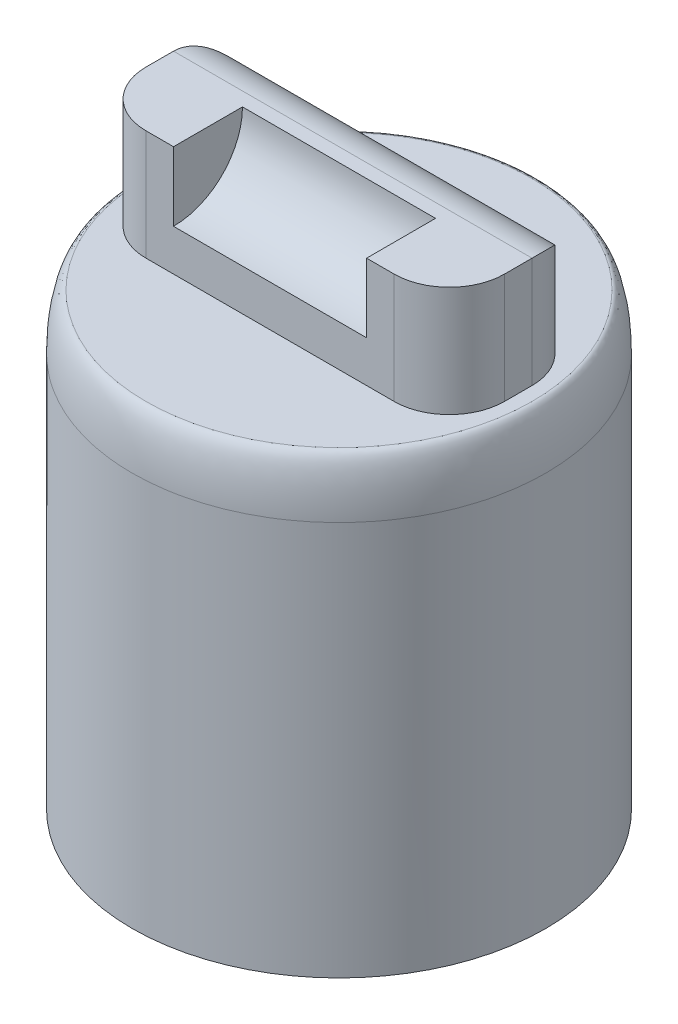
ISO-10303-21;
HEADER;
FILE_DESCRIPTION(('STEP AP214'),'2;1');
FILE_NAME('part.step','',(''),(''),'','','');
FILE_SCHEMA(('AUTOMOTIVE_DESIGN { 1 0 10303 214 1 1 1 1 }'));
ENDSEC;
DATA;
#1=APPLICATION_CONTEXT('core data for automotive mechanical design processes');
#2=APPLICATION_PROTOCOL_DEFINITION('international standard','automotive_design',2000,#1);
#3=PRODUCT_CONTEXT('',#1,'mechanical');
#4=PRODUCT('Part','Part','',(#3));
#5=PRODUCT_RELATED_PRODUCT_CATEGORY('part','',(#4));
#6=PRODUCT_DEFINITION_FORMATION('','',#4);
#7=PRODUCT_DEFINITION_CONTEXT('part definition',#1,'design');
#8=PRODUCT_DEFINITION('design','',#6,#7);
#9=PRODUCT_DEFINITION_SHAPE('','',#8);
#10=(LENGTH_UNIT() NAMED_UNIT(*) SI_UNIT(.MILLI.,.METRE.));
#11=(NAMED_UNIT(*) PLANE_ANGLE_UNIT() SI_UNIT($,.RADIAN.));
#12=(NAMED_UNIT(*) SI_UNIT($,.STERADIAN.) SOLID_ANGLE_UNIT());
#13=UNCERTAINTY_MEASURE_WITH_UNIT(LENGTH_MEASURE(1.E-05),#10,'distance_accuracy_value','');
#14=(GEOMETRIC_REPRESENTATION_CONTEXT(3) GLOBAL_UNCERTAINTY_ASSIGNED_CONTEXT((#13)) GLOBAL_UNIT_ASSIGNED_CONTEXT((#10,
#11,#12)) REPRESENTATION_CONTEXT('',''));
#15=CARTESIAN_POINT('',(0.,0.,0.));
#16=DIRECTION('',(0.,0.,1.));
#17=DIRECTION('',(1.,0.,0.));
#18=AXIS2_PLACEMENT_3D('',#15,#16,#17);
#19=CARTESIAN_POINT('',(0.,163.,0.));
#20=DIRECTION('',(0.,-1.,0.));
#21=DIRECTION('',(0.,0.,-1.));
#22=AXIS2_PLACEMENT_3D('',#19,#20,#21);
#23=CYLINDRICAL_SURFACE('',#22,75.);
#24=CARTESIAN_POINT('',(0.,143.,75.));
#25=CARTESIAN_POINT('',(9.8174770420761,143.,75.));
#26=CARTESIAN_POINT('',(19.6310913272354,143.,73.0479507500038));
#27=CARTESIAN_POINT('',(37.771423527528,143.,65.5339791266892));
#28=CARTESIAN_POINT('',(46.0910039983612,143.,59.9750131796209));
#29=CARTESIAN_POINT('',(59.9750131796209,143.,46.0910039983612));
#30=CARTESIAN_POINT('',(65.5339791267019,143.,37.7714235274974));
#31=CARTESIAN_POINT('',(73.0479507499911,143.,19.631091327266));
#32=CARTESIAN_POINT('',(75.,143.,9.81747704213418));
#33=CARTESIAN_POINT('',(75.,143.,-9.81747704213417));
#34=CARTESIAN_POINT('',(73.0479507500004,143.,-19.6310913272436));
#35=CARTESIAN_POINT('',(65.5339791266926,143.,-37.7714235275199));
#36=CARTESIAN_POINT('',(59.9750131796209,143.,-46.0910039983612));
#37=CARTESIAN_POINT('',(46.0910039983611,143.,-59.975013179621));
#38=CARTESIAN_POINT('',(37.7714235274975,143.,-65.5339791267018));
#39=CARTESIAN_POINT('',(19.6310913272661,143.,-73.0479507499911));
#40=CARTESIAN_POINT('',(9.81747704213418,143.,-75.));
#41=CARTESIAN_POINT('',(-9.81747704213417,143.,-75.));
#42=CARTESIAN_POINT('',(-19.6310913272388,143.,-73.0479507500024));
#43=CARTESIAN_POINT('',(-37.7714235275244,143.,-65.5339791266907));
#44=CARTESIAN_POINT('',(-46.0910039983453,143.,-59.9750131796368));
#45=CARTESIAN_POINT('',(-59.9750131796368,143.,-46.0910039983452));
#46=CARTESIAN_POINT('',(-65.5339791266992,143.,-37.7714235275038));
#47=CARTESIAN_POINT('',(-73.0479507499937,143.,-19.6310913272598));
#48=CARTESIAN_POINT('',(-75.,143.,-9.81747704213407));
#49=CARTESIAN_POINT('',(-75.,143.,9.81747704213431));
#50=CARTESIAN_POINT('',(-73.0479507499937,143.,19.6310913272596));
#51=CARTESIAN_POINT('',(-65.5339791266993,143.,37.7714235275037));
#52=CARTESIAN_POINT('',(-59.9750131796461,143.,46.0910039983359));
#53=CARTESIAN_POINT('',(-46.0910039983363,143.,59.9750131796458));
#54=CARTESIAN_POINT('',(-37.7714235275039,143.,65.5339791266992));
#55=CARTESIAN_POINT('',(-19.6310913272598,143.,73.0479507499937));
#56=CARTESIAN_POINT('',(-9.81747704207611,143.,75.));
#57=CARTESIAN_POINT('',(0.,143.,75.));
#58=(BOUNDED_CURVE() B_SPLINE_CURVE(3,(#24,#25,#26,#27,#28,#29,#30,#31,#32,#33,#34,#35,#36,#37,
#38,#39,#40,#41,#42,#43,#44,#45,#46,#47,#48,#49,#50,#51,#52,#53,#54,#55,#56,#57),.UNSPECIFIED.,
.T.,.F.) B_SPLINE_CURVE_WITH_KNOTS((4,2,2,2,2,2,2,2,2,2,2,2,2,2,2,2,4),(0.,0.392699081698724,
0.785398163397448,1.17809724509617,1.5707963267949,1.96349540849362,2.35619449019234,
2.74889357189107,3.14159265358979,3.53429173528852,3.92699081698724,4.31968989868597,
4.71238898038469,5.10508806208341,5.49778714378214,5.89048622548086,6.28318530717959),
.UNSPECIFIED.) CURVE() GEOMETRIC_REPRESENTATION_ITEM() RATIONAL_B_SPLINE_CURVE((1.,1.,1.,1.,1.,
1.,1.,1.,1.,1.,1.,1.,1.,1.,1.,1.,1.,1.,1.,1.,1.,1.,1.,1.,1.,1.,1.,1.,1.,1.,1.,1.,1.,1.)) REPRESENTATION_ITEM(''));
#59=CARTESIAN_POINT('',(0.,143.,75.));
#60=VERTEX_POINT('',#59);
#61=EDGE_CURVE('E234',#60,#60,#58,.F.);
#62=ORIENTED_EDGE('',*,*,#61,.T.);
#63=EDGE_LOOP('',(#62));
#64=FACE_BOUND('',#63,.T.);
#65=CARTESIAN_POINT('',(0.,0.,0.));
#66=DIRECTION('',(0.,1.,0.));
#67=DIRECTION('',(0.,0.,1.));
#68=AXIS2_PLACEMENT_3D('',#65,#66,#67);
#69=CIRCLE('',#68,75.);
#70=CARTESIAN_POINT('',(0.,0.,75.));
#71=VERTEX_POINT('',#70);
#72=EDGE_CURVE('E164',#71,#71,#69,.T.);
#73=ORIENTED_EDGE('',*,*,#72,.T.);
#74=EDGE_LOOP('',(#73));
#75=FACE_BOUND('',#74,.T.);
#76=ADVANCED_FACE('F39',(#64,#75),#23,.T.);
#77=CARTESIAN_POINT('',(0.,163.,0.));
#78=DIRECTION('',(0.,1.,0.));
#79=DIRECTION('',(0.,0.,1.));
#80=AXIS2_PLACEMENT_3D('',#77,#78,#79);
#81=PLANE('',#80);
#82=CARTESIAN_POINT('',(0.,163.,70.));
#83=CARTESIAN_POINT('',(-9.16297857260437,163.,70.));
#84=CARTESIAN_POINT('',(-18.322351905432,163.,68.1780873666415));
#85=CARTESIAN_POINT('',(-35.2533286256808,163.,61.1650471849386));
#86=CARTESIAN_POINT('',(-43.0182703984641,163.,55.9766789676525));
#87=CARTESIAN_POINT('',(-55.9766789676528,163.,43.0182703984638));
#88=CARTESIAN_POINT('',(-61.1650471849386,163.,35.2533286256806));
#89=CARTESIAN_POINT('',(-68.1780873666415,163.,18.3223519054318));
#90=CARTESIAN_POINT('',(-70.,163.,9.16297857265868));
#91=CARTESIAN_POINT('',(-70.,163.,-9.16297857265846));
#92=CARTESIAN_POINT('',(-68.1780873666415,163.,-18.322351905432));
#93=CARTESIAN_POINT('',(-61.1650471849386,163.,-35.2533286256807));
#94=CARTESIAN_POINT('',(-55.9766789676738,163.,-43.0182703984746));
#95=CARTESIAN_POINT('',(-43.0182703984429,163.,-55.9766789676419));
#96=CARTESIAN_POINT('',(-35.2533286256876,163.,-61.1650471849205));
#97=CARTESIAN_POINT('',(-18.3223519054247,163.,-68.1780873666597));
#98=CARTESIAN_POINT('',(-9.16297857265855,163.,-70.));
#99=CARTESIAN_POINT('',(9.16297857265857,163.,-70.));
#100=CARTESIAN_POINT('',(18.3223519054408,163.,-68.1780873666596));
#101=CARTESIAN_POINT('',(35.2533286256719,163.,-61.1650471849204));
#102=CARTESIAN_POINT('',(43.0182703984746,163.,-55.976678967642));
#103=CARTESIAN_POINT('',(55.9766789676419,163.,-43.0182703984747));
#104=CARTESIAN_POINT('',(61.1650471848569,163.,-35.2533286256718));
#105=CARTESIAN_POINT('',(68.1780873667232,163.,-18.3223519054408));
#106=CARTESIAN_POINT('',(70.,163.,-9.16297857265856));
#107=CARTESIAN_POINT('',(70.,163.,9.16297857265856));
#108=CARTESIAN_POINT('',(68.1780873666597,163.,18.3223519054407));
#109=CARTESIAN_POINT('',(61.1650471849205,163.,35.2533286256718));
#110=CARTESIAN_POINT('',(55.9766789676738,163.,43.0182703984747));
#111=CARTESIAN_POINT('',(43.0182703984429,163.,55.976678967642));
#112=CARTESIAN_POINT('',(35.2533286256729,163.,61.1650471849068));
#113=CARTESIAN_POINT('',(18.3223519054396,163.,68.1780873666733));
#114=CARTESIAN_POINT('',(9.16297857260436,163.,70.));
#115=CARTESIAN_POINT('',(0.,163.,70.));
#116=(BOUNDED_CURVE() B_SPLINE_CURVE(3,(#82,#83,#84,#85,#86,#87,#88,#89,#90,#91,#92,#93,#94,#95,
#96,#97,#98,#99,#100,#101,#102,#103,#104,#105,#106,#107,#108,#109,#110,#111,#112,#113,#114,
#115),.UNSPECIFIED.,.T.,.F.) B_SPLINE_CURVE_WITH_KNOTS((4,2,2,2,2,2,2,2,2,2,2,2,2,2,2,2,4),(0.,
0.392699081698725,0.785398163397448,1.17809724509617,1.5707963267949,1.96349540849362,
2.35619449019234,2.74889357189107,3.14159265358979,3.53429173528852,3.92699081698724,
4.31968989868597,4.71238898038469,5.10508806208341,5.49778714378214,5.89048622548086,
6.28318530717959),
.UNSPECIFIED.) CURVE() GEOMETRIC_REPRESENTATION_ITEM() RATIONAL_B_SPLINE_CURVE((1.,1.,1.,1.,1.,
1.,1.,1.,1.,1.,1.,1.,1.,1.,1.,1.,1.,1.,1.,1.,1.,1.,1.,1.,1.,1.,1.,1.,1.,1.,1.,1.,1.,1.)) REPRESENTATION_ITEM(''));
#117=CARTESIAN_POINT('',(0.,163.,70.));
#118=VERTEX_POINT('',#117);
#119=EDGE_CURVE('E177',#118,#118,#116,.F.);
#120=ORIENTED_EDGE('',*,*,#119,.T.);
#121=EDGE_LOOP('',(#120));
#122=FACE_BOUND('',#121,.T.);
#123=DIRECTION('',(0.,0.,-1.));
#124=VECTOR('',#123,1.);
#125=CARTESIAN_POINT('',(65.,163.,-25.));
#126=LINE('',#125,#124);
#127=CARTESIAN_POINT('',(65.,163.,5.00000000000001));
#128=VERTEX_POINT('',#127);
#129=CARTESIAN_POINT('',(65.,163.,-5.));
#130=VERTEX_POINT('',#129);
#131=EDGE_CURVE('E148',#128,#130,#126,.T.);
#132=ORIENTED_EDGE('',*,*,#131,.F.);
#133=CARTESIAN_POINT('',(45.,163.,5.00000000000001));
#134=DIRECTION('',(0.,1.,0.));
#135=DIRECTION('',(0.,0.,1.));
#136=AXIS2_PLACEMENT_3D('',#133,#134,#135);
#137=CIRCLE('',#136,20.);
#138=CARTESIAN_POINT('',(45.,163.,25.));
#139=VERTEX_POINT('',#138);
#140=EDGE_CURVE('E269',#128,#139,#137,.F.);
#141=ORIENTED_EDGE('',*,*,#140,.T.);
#142=DIRECTION('',(1.,0.,0.));
#143=VECTOR('',#142,1.);
#144=CARTESIAN_POINT('',(-65.,163.,25.));
#145=LINE('',#144,#143);
#146=CARTESIAN_POINT('',(-45.,163.,25.));
#147=VERTEX_POINT('',#146);
#148=EDGE_CURVE('E159',#147,#139,#145,.T.);
#149=ORIENTED_EDGE('',*,*,#148,.F.);
#150=CARTESIAN_POINT('',(-45.,163.,5.00000000000001));
#151=DIRECTION('',(0.,1.,0.));
#152=DIRECTION('',(0.,0.,1.));
#153=AXIS2_PLACEMENT_3D('',#150,#151,#152);
#154=CIRCLE('',#153,20.);
#155=CARTESIAN_POINT('',(-65.,163.,5.00000000000001));
#156=VERTEX_POINT('',#155);
#157=EDGE_CURVE('E48',#147,#156,#154,.F.);
#158=ORIENTED_EDGE('',*,*,#157,.T.);
#159=DIRECTION('',(0.,0.,1.));
#160=VECTOR('',#159,1.);
#161=CARTESIAN_POINT('',(-65.,163.,-25.));
#162=LINE('',#161,#160);
#163=CARTESIAN_POINT('',(-65.,163.,-5.));
#164=VERTEX_POINT('',#163);
#165=EDGE_CURVE('E168',#164,#156,#162,.T.);
#166=ORIENTED_EDGE('',*,*,#165,.F.);
#167=CARTESIAN_POINT('',(-45.,163.,-5.));
#168=DIRECTION('',(0.,1.,0.));
#169=DIRECTION('',(0.,0.,1.));
#170=AXIS2_PLACEMENT_3D('',#167,#168,#169);
#171=CIRCLE('',#170,20.);
#172=CARTESIAN_POINT('',(-45.,163.,-25.));
#173=VERTEX_POINT('',#172);
#174=EDGE_CURVE('E12',#164,#173,#171,.F.);
#175=ORIENTED_EDGE('',*,*,#174,.T.);
#176=DIRECTION('',(-1.,0.,0.));
#177=VECTOR('',#176,1.);
#178=CARTESIAN_POINT('',(-65.,163.,-25.));
#179=LINE('',#178,#177);
#180=CARTESIAN_POINT('',(45.,163.,-25.));
#181=VERTEX_POINT('',#180);
#182=EDGE_CURVE('E151',#181,#173,#179,.T.);
#183=ORIENTED_EDGE('',*,*,#182,.F.);
#184=CARTESIAN_POINT('',(45.,163.,-5.));
#185=DIRECTION('',(0.,1.,0.));
#186=DIRECTION('',(0.,0.,1.));
#187=AXIS2_PLACEMENT_3D('',#184,#185,#186);
#188=CIRCLE('',#187,20.);
#189=EDGE_CURVE('E271',#181,#130,#188,.F.);
#190=ORIENTED_EDGE('',*,*,#189,.T.);
#191=EDGE_LOOP('',(#132,#141,#149,#158,#166,#175,#183,#190));
#192=FACE_BOUND('',#191,.T.);
#193=ADVANCED_FACE('F188',(#122,#192),#81,.T.);
#194=CARTESIAN_POINT('',(0.,0.,0.));
#195=DIRECTION('',(0.,1.,0.));
#196=DIRECTION('',(0.,0.,1.));
#197=AXIS2_PLACEMENT_3D('',#194,#195,#196);
#198=PLANE('',#197);
#199=ORIENTED_EDGE('',*,*,#72,.F.);
#200=EDGE_LOOP('',(#199));
#201=FACE_BOUND('',#200,.T.);
#202=ADVANCED_FACE('F198',(#201),#198,.F.);
#203=CARTESIAN_POINT('',(65.,203.,-25.));
#204=DIRECTION('',(-1.,0.,0.));
#205=DIRECTION('',(0.,0.,1.));
#206=AXIS2_PLACEMENT_3D('',#203,#204,#205);
#207=PLANE('',#206);
#208=DIRECTION('',(0.,0.,-1.));
#209=VECTOR('',#208,1.);
#210=CARTESIAN_POINT('',(65.,203.,-25.));
#211=LINE('',#210,#209);
#212=CARTESIAN_POINT('',(65.,203.,5.00000000000001));
#213=VERTEX_POINT('',#212);
#214=CARTESIAN_POINT('',(65.,203.,-5.));
#215=VERTEX_POINT('',#214);
#216=EDGE_CURVE('E155',#213,#215,#211,.T.);
#217=ORIENTED_EDGE('',*,*,#216,.F.);
#218=DIRECTION('',(0.,-1.,0.));
#219=VECTOR('',#218,1.);
#220=CARTESIAN_POINT('',(65.,203.,5.00000000000001));
#221=LINE('',#220,#219);
#222=EDGE_CURVE('E258',#213,#128,#221,.T.);
#223=ORIENTED_EDGE('',*,*,#222,.T.);
#224=ORIENTED_EDGE('',*,*,#131,.T.);
#225=DIRECTION('',(0.,-1.,0.));
#226=VECTOR('',#225,1.);
#227=CARTESIAN_POINT('',(65.,203.,-5.));
#228=LINE('',#227,#226);
#229=EDGE_CURVE('E256',#130,#215,#228,.F.);
#230=ORIENTED_EDGE('',*,*,#229,.T.);
#231=EDGE_LOOP('',(#217,#223,#224,#230));
#232=FACE_BOUND('',#231,.T.);
#233=ADVANCED_FACE('F199',(#232),#207,.F.);
#234=CARTESIAN_POINT('',(-65.,203.,-25.));
#235=DIRECTION('',(0.,0.,1.));
#236=DIRECTION('',(1.,0.,0.));
#237=AXIS2_PLACEMENT_3D('',#234,#235,#236);
#238=PLANE('',#237);
#239=DIRECTION('',(-1.,0.,0.));
#240=VECTOR('',#239,1.);
#241=CARTESIAN_POINT('',(65.,183.,-25.));
#242=LINE('',#241,#240);
#243=CARTESIAN_POINT('',(-45.,183.,-25.));
#244=VERTEX_POINT('',#243);
#245=CARTESIAN_POINT('',(45.,183.,-25.));
#246=VERTEX_POINT('',#245);
#247=EDGE_CURVE('E252',#244,#246,#242,.F.);
#248=ORIENTED_EDGE('',*,*,#247,.T.);
#249=DIRECTION('',(0.,-1.,0.));
#250=VECTOR('',#249,1.);
#251=CARTESIAN_POINT('',(45.,203.,-25.));
#252=LINE('',#251,#250);
#253=EDGE_CURVE('E254',#246,#181,#252,.T.);
#254=ORIENTED_EDGE('',*,*,#253,.T.);
#255=ORIENTED_EDGE('',*,*,#182,.T.);
#256=DIRECTION('',(0.,-1.,0.));
#257=VECTOR('',#256,1.);
#258=CARTESIAN_POINT('',(-45.,203.,-25.));
#259=LINE('',#258,#257);
#260=EDGE_CURVE('E250',#173,#244,#259,.F.);
#261=ORIENTED_EDGE('',*,*,#260,.T.);
#262=EDGE_LOOP('',(#248,#254,#255,#261));
#263=FACE_BOUND('',#262,.T.);
#264=ADVANCED_FACE('F288',(#263),#238,.F.);
#265=CARTESIAN_POINT('',(-65.,203.,-25.));
#266=DIRECTION('',(1.,0.,0.));
#267=DIRECTION('',(0.,0.,-1.));
#268=AXIS2_PLACEMENT_3D('',#265,#266,#267);
#269=PLANE('',#268);
#270=ORIENTED_EDGE('',*,*,#165,.T.);
#271=DIRECTION('',(0.,-1.,0.));
#272=VECTOR('',#271,1.);
#273=CARTESIAN_POINT('',(-65.,203.,5.00000000000001));
#274=LINE('',#273,#272);
#275=CARTESIAN_POINT('',(-65.,203.,5.00000000000001));
#276=VERTEX_POINT('',#275);
#277=EDGE_CURVE('E267',#156,#276,#274,.F.);
#278=ORIENTED_EDGE('',*,*,#277,.T.);
#279=DIRECTION('',(0.,0.,1.));
#280=VECTOR('',#279,1.);
#281=CARTESIAN_POINT('',(-65.,203.,-25.));
#282=LINE('',#281,#280);
#283=CARTESIAN_POINT('',(-65.,203.,-5.));
#284=VERTEX_POINT('',#283);
#285=EDGE_CURVE('E158',#284,#276,#282,.T.);
#286=ORIENTED_EDGE('',*,*,#285,.F.);
#287=DIRECTION('',(0.,-1.,0.));
#288=VECTOR('',#287,1.);
#289=CARTESIAN_POINT('',(-65.,203.,-5.));
#290=LINE('',#289,#288);
#291=EDGE_CURVE('E62',#284,#164,#290,.T.);
#292=ORIENTED_EDGE('',*,*,#291,.T.);
#293=EDGE_LOOP('',(#270,#278,#286,#292));
#294=FACE_BOUND('',#293,.T.);
#295=ADVANCED_FACE('F298',(#294),#269,.F.);
#296=CARTESIAN_POINT('',(-65.,203.,25.));
#297=DIRECTION('',(0.,0.,-1.));
#298=DIRECTION('',(-1.,0.,0.));
#299=AXIS2_PLACEMENT_3D('',#296,#297,#298);
#300=PLANE('',#299);
#301=ORIENTED_EDGE('',*,*,#148,.T.);
#302=DIRECTION('',(0.,-1.,0.));
#303=VECTOR('',#302,1.);
#304=CARTESIAN_POINT('',(45.,203.,25.));
#305=LINE('',#304,#303);
#306=CARTESIAN_POINT('',(45.,203.,25.));
#307=VERTEX_POINT('',#306);
#308=EDGE_CURVE('E264',#139,#307,#305,.F.);
#309=ORIENTED_EDGE('',*,*,#308,.T.);
#310=DIRECTION('',(1.,0.,0.));
#311=VECTOR('',#310,1.);
#312=CARTESIAN_POINT('',(-65.,203.,25.));
#313=LINE('',#312,#311);
#314=CARTESIAN_POINT('',(35.,203.,25.));
#315=VERTEX_POINT('',#314);
#316=EDGE_CURVE('E162',#315,#307,#313,.T.);
#317=ORIENTED_EDGE('',*,*,#316,.F.);
#318=DIRECTION('',(0.,-1.,0.));
#319=VECTOR('',#318,1.);
#320=CARTESIAN_POINT('',(35.,203.,25.));
#321=LINE('',#320,#319);
#322=CARTESIAN_POINT('',(35.,178.,25.));
#323=VERTEX_POINT('',#322);
#324=EDGE_CURVE('E133',#315,#323,#321,.T.);
#325=ORIENTED_EDGE('',*,*,#324,.T.);
#326=DIRECTION('',(-1.,0.,0.));
#327=VECTOR('',#326,1.);
#328=CARTESIAN_POINT('',(35.,178.,25.));
#329=LINE('',#328,#327);
#330=CARTESIAN_POINT('',(-35.,178.,25.));
#331=VERTEX_POINT('',#330);
#332=EDGE_CURVE('E139',#331,#323,#329,.F.);
#333=ORIENTED_EDGE('',*,*,#332,.F.);
#334=DIRECTION('',(0.,-1.,0.));
#335=VECTOR('',#334,1.);
#336=CARTESIAN_POINT('',(-35.,203.,25.));
#337=LINE('',#336,#335);
#338=CARTESIAN_POINT('',(-35.,203.,25.));
#339=VERTEX_POINT('',#338);
#340=EDGE_CURVE('E123',#339,#331,#337,.T.);
#341=ORIENTED_EDGE('',*,*,#340,.F.);
#342=CARTESIAN_POINT('',(-45.,203.,25.));
#343=VERTEX_POINT('',#342);
#344=EDGE_CURVE('E163',#343,#339,#313,.T.);
#345=ORIENTED_EDGE('',*,*,#344,.F.);
#346=DIRECTION('',(0.,-1.,0.));
#347=VECTOR('',#346,1.);
#348=CARTESIAN_POINT('',(-45.,203.,25.));
#349=LINE('',#348,#347);
#350=EDGE_CURVE('E261',#343,#147,#349,.T.);
#351=ORIENTED_EDGE('',*,*,#350,.T.);
#352=EDGE_LOOP('',(#301,#309,#317,#325,#333,#341,#345,#351));
#353=FACE_BOUND('',#352,.T.);
#354=ADVANCED_FACE('F146',(#353),#300,.F.);
#355=CARTESIAN_POINT('',(0.,203.,0.));
#356=DIRECTION('',(0.,1.,0.));
#357=DIRECTION('',(0.,0.,1.));
#358=AXIS2_PLACEMENT_3D('',#355,#356,#357);
#359=PLANE('',#358);
#360=ORIENTED_EDGE('',*,*,#216,.T.);
#361=DIRECTION('',(-1.,0.,0.));
#362=VECTOR('',#361,1.);
#363=CARTESIAN_POINT('',(-65.,203.,-5.));
#364=LINE('',#363,#362);
#365=EDGE_CURVE('E247',#215,#284,#364,.T.);
#366=ORIENTED_EDGE('',*,*,#365,.T.);
#367=ORIENTED_EDGE('',*,*,#285,.T.);
#368=CARTESIAN_POINT('',(-45.,203.,5.00000000000001));
#369=DIRECTION('',(0.,1.,0.));
#370=DIRECTION('',(0.,0.,1.));
#371=AXIS2_PLACEMENT_3D('',#368,#369,#370);
#372=CIRCLE('',#371,20.);
#373=EDGE_CURVE('E238',#276,#343,#372,.T.);
#374=ORIENTED_EDGE('',*,*,#373,.T.);
#375=ORIENTED_EDGE('',*,*,#344,.T.);
#376=DIRECTION('',(0.,0.,-1.));
#377=VECTOR('',#376,1.);
#378=CARTESIAN_POINT('',(-35.,203.,0.));
#379=LINE('',#378,#377);
#380=CARTESIAN_POINT('',(-35.,203.,0.));
#381=VERTEX_POINT('',#380);
#382=EDGE_CURVE('E129',#339,#381,#379,.T.);
#383=ORIENTED_EDGE('',*,*,#382,.T.);
#384=DIRECTION('',(-1.,0.,0.));
#385=VECTOR('',#384,1.);
#386=CARTESIAN_POINT('',(35.,203.,0.));
#387=LINE('',#386,#385);
#388=CARTESIAN_POINT('',(35.,203.,0.));
#389=VERTEX_POINT('',#388);
#390=EDGE_CURVE('E142',#381,#389,#387,.F.);
#391=ORIENTED_EDGE('',*,*,#390,.T.);
#392=DIRECTION('',(0.,0.,-1.));
#393=VECTOR('',#392,1.);
#394=CARTESIAN_POINT('',(35.,203.,0.));
#395=LINE('',#394,#393);
#396=EDGE_CURVE('E175',#315,#389,#395,.T.);
#397=ORIENTED_EDGE('',*,*,#396,.F.);
#398=ORIENTED_EDGE('',*,*,#316,.T.);
#399=CARTESIAN_POINT('',(45.,203.,5.00000000000001));
#400=DIRECTION('',(0.,1.,0.));
#401=DIRECTION('',(0.,0.,1.));
#402=AXIS2_PLACEMENT_3D('',#399,#400,#401);
#403=CIRCLE('',#402,20.);
#404=EDGE_CURVE('E245',#307,#213,#403,.T.);
#405=ORIENTED_EDGE('',*,*,#404,.T.);
#406=EDGE_LOOP('',(#360,#366,#367,#374,#375,#383,#391,#397,#398,#405));
#407=FACE_BOUND('',#406,.T.);
#408=ADVANCED_FACE('F295',(#407),#359,.T.);
#409=CARTESIAN_POINT('',(35.,203.,25.));
#410=DIRECTION('',(-1.,0.,0.));
#411=DIRECTION('',(0.,0.,1.));
#412=AXIS2_PLACEMENT_3D('',#409,#410,#411);
#413=CYLINDRICAL_SURFACE('',#412,25.);
#414=ORIENTED_EDGE('',*,*,#332,.T.);
#415=CARTESIAN_POINT('',(35.,203.,25.));
#416=DIRECTION('',(1.,0.,0.));
#417=DIRECTION('',(0.,0.,-1.));
#418=AXIS2_PLACEMENT_3D('',#415,#416,#417);
#419=CIRCLE('',#418,25.);
#420=EDGE_CURVE('E134',#323,#389,#419,.T.);
#421=ORIENTED_EDGE('',*,*,#420,.T.);
#422=ORIENTED_EDGE('',*,*,#390,.F.);
#423=CARTESIAN_POINT('',(-35.,203.,25.));
#424=DIRECTION('',(1.,0.,0.));
#425=DIRECTION('',(0.,0.,-1.));
#426=AXIS2_PLACEMENT_3D('',#423,#424,#425);
#427=CIRCLE('',#426,25.);
#428=EDGE_CURVE('E126',#331,#381,#427,.T.);
#429=ORIENTED_EDGE('',*,*,#428,.F.);
#430=EDGE_LOOP('',(#414,#421,#422,#429));
#431=FACE_BOUND('',#430,.T.);
#432=ADVANCED_FACE('F137',(#431),#413,.F.);
#433=CARTESIAN_POINT('',(35.,203.,25.));
#434=DIRECTION('',(1.,0.,0.));
#435=DIRECTION('',(0.,0.,-1.));
#436=AXIS2_PLACEMENT_3D('',#433,#434,#435);
#437=PLANE('',#436);
#438=ORIENTED_EDGE('',*,*,#396,.T.);
#439=ORIENTED_EDGE('',*,*,#420,.F.);
#440=ORIENTED_EDGE('',*,*,#324,.F.);
#441=EDGE_LOOP('',(#438,#439,#440));
#442=FACE_BOUND('',#441,.T.);
#443=ADVANCED_FACE('F323',(#442),#437,.F.);
#444=CARTESIAN_POINT('',(-35.,203.,25.));
#445=DIRECTION('',(1.,0.,0.));
#446=DIRECTION('',(0.,0.,-1.));
#447=AXIS2_PLACEMENT_3D('',#444,#445,#446);
#448=PLANE('',#447);
#449=ORIENTED_EDGE('',*,*,#340,.T.);
#450=ORIENTED_EDGE('',*,*,#428,.T.);
#451=ORIENTED_EDGE('',*,*,#382,.F.);
#452=EDGE_LOOP('',(#449,#450,#451));
#453=FACE_BOUND('',#452,.T.);
#454=ADVANCED_FACE('F125',(#453),#448,.T.);
#455=CARTESIAN_POINT('',(0.,163.,70.));
#456=CARTESIAN_POINT('',(9.16297857260436,163.,70.));
#457=CARTESIAN_POINT('',(18.3223519054396,163.,68.1780873666733));
#458=CARTESIAN_POINT('',(35.2533286256729,163.,61.1650471849068));
#459=CARTESIAN_POINT('',(43.0182703984429,163.,55.976678967642));
#460=CARTESIAN_POINT('',(55.9766789676738,163.,43.0182703984747));
#461=CARTESIAN_POINT('',(61.1650471849205,163.,35.2533286256718));
#462=CARTESIAN_POINT('',(68.1780873666597,163.,18.3223519054407));
#463=CARTESIAN_POINT('',(70.,163.,9.16297857265856));
#464=CARTESIAN_POINT('',(70.,163.,-9.16297857265856));
#465=CARTESIAN_POINT('',(68.1780873667232,163.,-18.3223519054408));
#466=CARTESIAN_POINT('',(61.1650471848569,163.,-35.2533286256718));
#467=CARTESIAN_POINT('',(55.9766789676419,163.,-43.0182703984747));
#468=CARTESIAN_POINT('',(43.0182703984746,163.,-55.976678967642));
#469=CARTESIAN_POINT('',(35.2533286256719,163.,-61.1650471849204));
#470=CARTESIAN_POINT('',(18.3223519054408,163.,-68.1780873666596));
#471=CARTESIAN_POINT('',(9.16297857265857,163.,-70.));
#472=CARTESIAN_POINT('',(-9.16297857265855,163.,-70.));
#473=CARTESIAN_POINT('',(-18.3223519054247,163.,-68.1780873666597));
#474=CARTESIAN_POINT('',(-35.2533286256876,163.,-61.1650471849205));
#475=CARTESIAN_POINT('',(-43.0182703984429,163.,-55.9766789676419));
#476=CARTESIAN_POINT('',(-55.9766789676738,163.,-43.0182703984746));
#477=CARTESIAN_POINT('',(-61.1650471849386,163.,-35.2533286256807));
#478=CARTESIAN_POINT('',(-68.1780873666415,163.,-18.322351905432));
#479=CARTESIAN_POINT('',(-70.,163.,-9.16297857265846));
#480=CARTESIAN_POINT('',(-70.,163.,9.16297857265868));
#481=CARTESIAN_POINT('',(-68.1780873666415,163.,18.3223519054318));
#482=CARTESIAN_POINT('',(-61.1650471849386,163.,35.2533286256806));
#483=CARTESIAN_POINT('',(-55.9766789676528,163.,43.0182703984638));
#484=CARTESIAN_POINT('',(-43.0182703984641,163.,55.9766789676525));
#485=CARTESIAN_POINT('',(-35.2533286256808,163.,61.1650471849386));
#486=CARTESIAN_POINT('',(-18.322351905432,163.,68.1780873666415));
#487=CARTESIAN_POINT('',(-9.16297857260437,163.,70.));
#488=CARTESIAN_POINT('',(0.,163.,70.));
#489=CARTESIAN_POINT('',(0.,163.,75.));
#490=CARTESIAN_POINT('',(9.8174770420761,163.,75.));
#491=CARTESIAN_POINT('',(19.6310913272613,163.,73.0479507500661));
#492=CARTESIAN_POINT('',(37.7714235275022,163.,65.5339791266269));
#493=CARTESIAN_POINT('',(46.091003998393,163.,59.9750131795891));
#494=CARTESIAN_POINT('',(59.9750131795891,163.,46.091003998393));
#495=CARTESIAN_POINT('',(65.533979126705,163.,37.7714235275305));
#496=CARTESIAN_POINT('',(73.047950749988,163.,19.6310913272329));
#497=CARTESIAN_POINT('',(75.,163.,9.81747704213418));
#498=CARTESIAN_POINT('',(75.,163.,-9.81747704213417));
#499=CARTESIAN_POINT('',(73.0479507500515,163.,-19.6310913272648));
#500=CARTESIAN_POINT('',(65.5339791266414,163.,-37.7714235274987));
#501=CARTESIAN_POINT('',(59.9750131796527,163.,-46.0910039983612));
#502=CARTESIAN_POINT('',(46.0910039983293,163.,-59.975013179621));
#503=CARTESIAN_POINT('',(37.7714235274988,163.,-65.533979126705));
#504=CARTESIAN_POINT('',(19.6310913272648,163.,-73.0479507499879));
#505=CARTESIAN_POINT('',(9.81747704213418,163.,-75.));
#506=CARTESIAN_POINT('',(-9.81747704213417,163.,-75.));
#507=CARTESIAN_POINT('',(-19.6310913272487,163.,-73.047950749988));
#508=CARTESIAN_POINT('',(-37.7714235275145,163.,-65.533979126705));
#509=CARTESIAN_POINT('',(-46.0910039983294,163.,-59.9750131796527));
#510=CARTESIAN_POINT('',(-59.9750131796527,163.,-46.0910039983293));
#511=CARTESIAN_POINT('',(-65.5339791267154,163.,-37.7714235275105));
#512=CARTESIAN_POINT('',(-73.0479507499775,163.,-19.6310913272531));
#513=CARTESIAN_POINT('',(-75.,163.,-9.81747704213407));
#514=CARTESIAN_POINT('',(-75.,163.,9.81747704213431));
#515=CARTESIAN_POINT('',(-73.0479507499776,163.,19.6310913272529));
#516=CARTESIAN_POINT('',(-65.5339791267154,163.,37.7714235275103));
#517=CARTESIAN_POINT('',(-59.9750131796143,163.,46.0910039983678));
#518=CARTESIAN_POINT('',(-46.0910039983681,163.,59.975013179614));
#519=CARTESIAN_POINT('',(-37.7714235274788,163.,65.5339791267154));
#520=CARTESIAN_POINT('',(-19.6310913272849,163.,73.0479507499775));
#521=CARTESIAN_POINT('',(-9.81747704207611,163.,75.));
#522=CARTESIAN_POINT('',(0.,163.,75.));
#523=CARTESIAN_POINT('',(0.,143.,75.));
#524=CARTESIAN_POINT('',(9.8174770420761,143.,75.));
#525=CARTESIAN_POINT('',(19.6310913272354,143.,73.0479507500038));
#526=CARTESIAN_POINT('',(37.771423527528,143.,65.5339791266892));
#527=CARTESIAN_POINT('',(46.0910039983612,143.,59.9750131796209));
#528=CARTESIAN_POINT('',(59.9750131796209,143.,46.0910039983612));
#529=CARTESIAN_POINT('',(65.5339791267019,143.,37.7714235274974));
#530=CARTESIAN_POINT('',(73.0479507499911,143.,19.631091327266));
#531=CARTESIAN_POINT('',(75.,143.,9.81747704213418));
#532=CARTESIAN_POINT('',(75.,143.,-9.81747704213417));
#533=CARTESIAN_POINT('',(73.0479507500004,143.,-19.6310913272436));
#534=CARTESIAN_POINT('',(65.5339791266926,143.,-37.7714235275199));
#535=CARTESIAN_POINT('',(59.9750131796209,143.,-46.0910039983612));
#536=CARTESIAN_POINT('',(46.0910039983611,143.,-59.975013179621));
#537=CARTESIAN_POINT('',(37.7714235274975,143.,-65.5339791267018));
#538=CARTESIAN_POINT('',(19.6310913272661,143.,-73.0479507499911));
#539=CARTESIAN_POINT('',(9.81747704213418,143.,-75.));
#540=CARTESIAN_POINT('',(-9.81747704213417,143.,-75.));
#541=CARTESIAN_POINT('',(-19.6310913272388,143.,-73.0479507500024));
#542=CARTESIAN_POINT('',(-37.7714235275244,143.,-65.5339791266907));
#543=CARTESIAN_POINT('',(-46.0910039983453,143.,-59.9750131796368));
#544=CARTESIAN_POINT('',(-59.9750131796368,143.,-46.0910039983452));
#545=CARTESIAN_POINT('',(-65.5339791266992,143.,-37.7714235275038));
#546=CARTESIAN_POINT('',(-73.0479507499937,143.,-19.6310913272598));
#547=CARTESIAN_POINT('',(-75.,143.,-9.81747704213407));
#548=CARTESIAN_POINT('',(-75.,143.,9.81747704213431));
#549=CARTESIAN_POINT('',(-73.0479507499937,143.,19.6310913272596));
#550=CARTESIAN_POINT('',(-65.5339791266993,143.,37.7714235275037));
#551=CARTESIAN_POINT('',(-59.9750131796461,143.,46.0910039983359));
#552=CARTESIAN_POINT('',(-46.0910039983363,143.,59.9750131796458));
#553=CARTESIAN_POINT('',(-37.7714235275039,143.,65.5339791266992));
#554=CARTESIAN_POINT('',(-19.6310913272598,143.,73.0479507499937));
#555=CARTESIAN_POINT('',(-9.81747704207611,143.,75.));
#556=CARTESIAN_POINT('',(0.,143.,75.));
#557=(BOUNDED_SURFACE() B_SPLINE_SURFACE(2,3,((#455,#456,#457,#458,#459,#460,#461,#462,#463,
#464,#465,#466,#467,#468,#469,#470,#471,#472,#473,#474,#475,#476,#477,#478,#479,#480,#481,#482,
#483,#484,#485,#486,#487,#488),(#489,#490,#491,#492,#493,#494,#495,#496,#497,#498,#499,#500,
#501,#502,#503,#504,#505,#506,#507,#508,#509,#510,#511,#512,#513,#514,#515,#516,#517,#518,#519,
#520,#521,#522),(#523,#524,#525,#526,#527,#528,#529,#530,#531,#532,#533,#534,#535,#536,#537,
#538,#539,#540,#541,#542,#543,#544,#545,#546,#547,#548,#549,#550,#551,#552,#553,#554,#555,
#556)),.UNSPECIFIED.,.F.,.T.,.F.) B_SPLINE_SURFACE_WITH_KNOTS((3,3),(4,2,2,2,2,2,2,2,2,2,2,2,2,
2,2,2,4),(0.,1.),(0.,0.392699081698724,0.785398163397448,1.17809724509617,1.5707963267949,
1.96349540849362,2.35619449019234,2.74889357189107,3.14159265358979,3.53429173528852,
3.92699081698724,4.31968989868597,4.71238898038469,5.10508806208341,5.49778714378214,
5.89048622548086,6.28318530717959),
.UNSPECIFIED.) GEOMETRIC_REPRESENTATION_ITEM() RATIONAL_B_SPLINE_SURFACE(((1.,1.,1.,1.,1.,1.,1.,
1.,1.,1.,1.,1.,1.,1.,1.,1.,1.,1.,1.,1.,1.,1.,1.,1.,1.,1.,1.,1.,1.,1.,1.,1.,1.,1.),
(0.707106781186548,0.707106781186548,0.707106781186548,0.707106781186548,0.707106781186548,
0.707106781186548,0.707106781186548,0.707106781186548,0.707106781186548,0.707106781186548,
0.707106781186548,0.707106781186548,0.707106781186547,0.707106781186547,0.707106781186547,
0.707106781186547,0.707106781186548,0.707106781186548,0.707106781186548,0.707106781186548,
0.707106781186547,0.707106781186547,0.707106781186548,0.707106781186548,0.707106781186548,
0.707106781186548,0.707106781186547,0.707106781186547,0.707106781186547,0.707106781186547,
0.707106781186548,0.707106781186548,0.707106781186548,0.707106781186548),(1.,1.,1.,1.,1.,1.,1.,
1.,1.,1.,1.,1.,1.,1.,1.,1.,1.,1.,1.,1.,1.,1.,1.,1.,1.,1.,1.,1.,1.,1.,1.,1.,1.,1.))) REPRESENTATION_ITEM('') SURFACE());
#558=ORIENTED_EDGE('',*,*,#61,.F.);
#559=EDGE_LOOP('',(#558));
#560=FACE_BOUND('',#559,.T.);
#561=ORIENTED_EDGE('',*,*,#119,.F.);
#562=EDGE_LOOP('',(#561));
#563=FACE_BOUND('',#562,.T.);
#564=ADVANCED_FACE('F208',(#560,#563),#557,.T.);
#565=CARTESIAN_POINT('',(45.,203.,-5.));
#566=DIRECTION('',(0.,-1.,0.));
#567=DIRECTION('',(0.,0.,-1.));
#568=AXIS2_PLACEMENT_3D('',#565,#566,#567);
#569=CYLINDRICAL_SURFACE('',#568,20.);
#570=ORIENTED_EDGE('',*,*,#189,.F.);
#571=ORIENTED_EDGE('',*,*,#253,.F.);
#572=CARTESIAN_POINT('',(45.,183.,-5.));
#573=DIRECTION('',(0.707106781186547,-0.707106781186547,0.));
#574=DIRECTION('',(-0.707106781186547,-0.707106781186547,0.));
#575=AXIS2_PLACEMENT_3D('',#572,#573,#574);
#576=ELLIPSE('',#575,28.2842712474619,20.);
#577=EDGE_CURVE('E43',#215,#246,#576,.F.);
#578=ORIENTED_EDGE('',*,*,#577,.F.);
#579=ORIENTED_EDGE('',*,*,#229,.F.);
#580=EDGE_LOOP('',(#570,#571,#578,#579));
#581=FACE_BOUND('',#580,.T.);
#582=ADVANCED_FACE('F285',(#581),#569,.T.);
#583=CARTESIAN_POINT('',(-45.,203.,-5.));
#584=DIRECTION('',(0.,-1.,0.));
#585=DIRECTION('',(0.,0.,-1.));
#586=AXIS2_PLACEMENT_3D('',#583,#584,#585);
#587=CYLINDRICAL_SURFACE('',#586,20.);
#588=ORIENTED_EDGE('',*,*,#174,.F.);
#589=ORIENTED_EDGE('',*,*,#291,.F.);
#590=CARTESIAN_POINT('',(-45.,183.,-5.));
#591=DIRECTION('',(-0.707106781186547,-0.707106781186547,0.));
#592=DIRECTION('',(0.707106781186547,-0.707106781186547,0.));
#593=AXIS2_PLACEMENT_3D('',#590,#591,#592);
#594=ELLIPSE('',#593,28.2842712474619,20.);
#595=EDGE_CURVE('E273',#244,#284,#594,.F.);
#596=ORIENTED_EDGE('',*,*,#595,.F.);
#597=ORIENTED_EDGE('',*,*,#260,.F.);
#598=EDGE_LOOP('',(#588,#589,#596,#597));
#599=FACE_BOUND('',#598,.T.);
#600=ADVANCED_FACE('F293',(#599),#587,.T.);
#601=CARTESIAN_POINT('',(0.,183.,-5.));
#602=DIRECTION('',(1.,0.,0.));
#603=DIRECTION('',(0.,0.,-1.));
#604=AXIS2_PLACEMENT_3D('',#601,#602,#603);
#605=CYLINDRICAL_SURFACE('',#604,20.);
#606=ORIENTED_EDGE('',*,*,#577,.T.);
#607=ORIENTED_EDGE('',*,*,#247,.F.);
#608=ORIENTED_EDGE('',*,*,#595,.T.);
#609=ORIENTED_EDGE('',*,*,#365,.F.);
#610=EDGE_LOOP('',(#606,#607,#608,#609));
#611=FACE_BOUND('',#610,.T.);
#612=ADVANCED_FACE('F280',(#611),#605,.T.);
#613=CARTESIAN_POINT('',(45.,203.,5.00000000000001));
#614=DIRECTION('',(0.,-1.,0.));
#615=DIRECTION('',(0.,0.,-1.));
#616=AXIS2_PLACEMENT_3D('',#613,#614,#615);
#617=CYLINDRICAL_SURFACE('',#616,20.);
#618=ORIENTED_EDGE('',*,*,#404,.F.);
#619=ORIENTED_EDGE('',*,*,#308,.F.);
#620=ORIENTED_EDGE('',*,*,#140,.F.);
#621=ORIENTED_EDGE('',*,*,#222,.F.);
#622=EDGE_LOOP('',(#618,#619,#620,#621));
#623=FACE_BOUND('',#622,.T.);
#624=ADVANCED_FACE('F306',(#623),#617,.T.);
#625=CARTESIAN_POINT('',(-45.,203.,5.00000000000001));
#626=DIRECTION('',(0.,-1.,0.));
#627=DIRECTION('',(0.,0.,-1.));
#628=AXIS2_PLACEMENT_3D('',#625,#626,#627);
#629=CYLINDRICAL_SURFACE('',#628,20.);
#630=ORIENTED_EDGE('',*,*,#373,.F.);
#631=ORIENTED_EDGE('',*,*,#277,.F.);
#632=ORIENTED_EDGE('',*,*,#157,.F.);
#633=ORIENTED_EDGE('',*,*,#350,.F.);
#634=EDGE_LOOP('',(#630,#631,#632,#633));
#635=FACE_BOUND('',#634,.T.);
#636=ADVANCED_FACE('F41',(#635),#629,.T.);
#637=CLOSED_SHELL('',(#76,#193,#202,#233,#264,#295,#354,#408,#432,#443,#454,#564,#582,#600,#612,
#624,#636));
#638=MANIFOLD_SOLID_BREP('B2',#637);
#639=ADVANCED_BREP_SHAPE_REPRESENTATION('',(#18,#638),#14);
#640=SHAPE_DEFINITION_REPRESENTATION(#9,#639);
ENDSEC;
END-ISO-10303-21;
